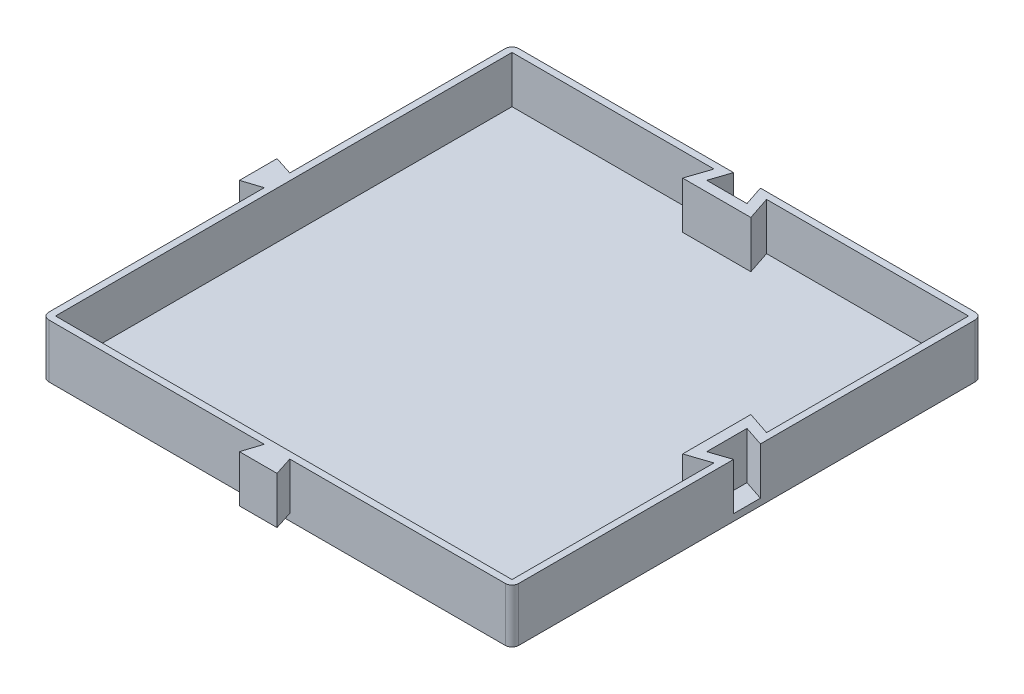
ISO-10303-21;
HEADER;
FILE_DESCRIPTION(('STEP AP214'),'2;1');
FILE_NAME('part.step','',(''),(''),'','','');
FILE_SCHEMA(('AUTOMOTIVE_DESIGN { 1 0 10303 214 1 1 1 1 }'));
ENDSEC;
DATA;
#1=APPLICATION_CONTEXT('core data for automotive mechanical design processes');
#2=APPLICATION_PROTOCOL_DEFINITION('international standard','automotive_design',2000,#1);
#3=PRODUCT_CONTEXT('',#1,'mechanical');
#4=PRODUCT('Part','Part','',(#3));
#5=PRODUCT_RELATED_PRODUCT_CATEGORY('part','',(#4));
#6=PRODUCT_DEFINITION_FORMATION('','',#4);
#7=PRODUCT_DEFINITION_CONTEXT('part definition',#1,'design');
#8=PRODUCT_DEFINITION('design','',#6,#7);
#9=PRODUCT_DEFINITION_SHAPE('','',#8);
#10=(LENGTH_UNIT() NAMED_UNIT(*) SI_UNIT(.MILLI.,.METRE.));
#11=(NAMED_UNIT(*) PLANE_ANGLE_UNIT() SI_UNIT($,.RADIAN.));
#12=(NAMED_UNIT(*) SI_UNIT($,.STERADIAN.) SOLID_ANGLE_UNIT());
#13=UNCERTAINTY_MEASURE_WITH_UNIT(LENGTH_MEASURE(1.E-05),#10,'distance_accuracy_value','');
#14=(GEOMETRIC_REPRESENTATION_CONTEXT(3) GLOBAL_UNCERTAINTY_ASSIGNED_CONTEXT((#13)) GLOBAL_UNIT_ASSIGNED_CONTEXT((#10,
#11,#12)) REPRESENTATION_CONTEXT('',''));
#15=CARTESIAN_POINT('',(0.,0.,0.));
#16=DIRECTION('',(0.,0.,1.));
#17=DIRECTION('',(1.,0.,0.));
#18=AXIS2_PLACEMENT_3D('',#15,#16,#17);
#19=CARTESIAN_POINT('',(0.,10.16,0.));
#20=DIRECTION('',(1.,0.,0.));
#21=DIRECTION('',(0.,0.,-1.));
#22=AXIS2_PLACEMENT_3D('',#19,#20,#21);
#23=PLANE('',#22);
#24=DIRECTION('',(0.,-1.,0.));
#25=VECTOR('',#24,1.);
#26=CARTESIAN_POINT('',(0.,10.16,-46.8630000000002));
#27=LINE('',#26,#25);
#28=CARTESIAN_POINT('',(0.,10.16,-46.8630000000002));
#29=VERTEX_POINT('',#28);
#30=CARTESIAN_POINT('',(0.,1.27,-46.8630000000002));
#31=VERTEX_POINT('',#30);
#32=EDGE_CURVE('E275',#29,#31,#27,.T.);
#33=ORIENTED_EDGE('',*,*,#32,.F.);
#34=DIRECTION('',(0.,0.,1.));
#35=VECTOR('',#34,1.);
#36=CARTESIAN_POINT('',(0.,10.16,0.));
#37=LINE('',#36,#35);
#38=CARTESIAN_POINT('',(0.,10.16,-87.63));
#39=VERTEX_POINT('',#38);
#40=EDGE_CURVE('E478',#39,#29,#37,.T.);
#41=ORIENTED_EDGE('',*,*,#40,.F.);
#42=DIRECTION('',(0.,-1.,0.));
#43=VECTOR('',#42,1.);
#44=CARTESIAN_POINT('',(0.,10.16,-87.63));
#45=LINE('',#44,#43);
#46=CARTESIAN_POINT('',(0.,0.,-87.63));
#47=VERTEX_POINT('',#46);
#48=EDGE_CURVE('E532',#39,#47,#45,.T.);
#49=ORIENTED_EDGE('',*,*,#48,.T.);
#50=DIRECTION('',(0.,0.,1.));
#51=VECTOR('',#50,1.);
#52=CARTESIAN_POINT('',(0.,0.,0.));
#53=LINE('',#52,#51);
#54=CARTESIAN_POINT('',(0.,0.,-1.27));
#55=VERTEX_POINT('',#54);
#56=EDGE_CURVE('E471',#47,#55,#53,.T.);
#57=ORIENTED_EDGE('',*,*,#56,.T.);
#58=DIRECTION('',(0.,-1.,0.));
#59=VECTOR('',#58,1.);
#60=CARTESIAN_POINT('',(0.,10.16,-1.27));
#61=LINE('',#60,#59);
#62=CARTESIAN_POINT('',(0.,10.16,-1.27));
#63=VERTEX_POINT('',#62);
#64=EDGE_CURVE('E535',#55,#63,#61,.F.);
#65=ORIENTED_EDGE('',*,*,#64,.T.);
#66=CARTESIAN_POINT('',(0.,10.16,-42.0370000000002));
#67=VERTEX_POINT('',#66);
#68=EDGE_CURVE('E62',#67,#63,#37,.T.);
#69=ORIENTED_EDGE('',*,*,#68,.F.);
#70=DIRECTION('',(0.,-1.,0.));
#71=VECTOR('',#70,1.);
#72=CARTESIAN_POINT('',(0.,10.16,-42.0370000000002));
#73=LINE('',#72,#71);
#74=CARTESIAN_POINT('',(0.,1.27,-42.0370000000002));
#75=VERTEX_POINT('',#74);
#76=EDGE_CURVE('E271',#67,#75,#73,.T.);
#77=ORIENTED_EDGE('',*,*,#76,.T.);
#78=DIRECTION('',(0.,0.,-1.));
#79=VECTOR('',#78,1.);
#80=CARTESIAN_POINT('',(0.,1.27,-46.8630000000002));
#81=LINE('',#80,#79);
#82=EDGE_CURVE('E56',#75,#31,#81,.T.);
#83=ORIENTED_EDGE('',*,*,#82,.T.);
#84=EDGE_LOOP('',(#33,#41,#49,#57,#65,#69,#77,#83));
#85=FACE_BOUND('',#84,.T.);
#86=ADVANCED_FACE('F41',(#85),#23,.F.);
#87=CARTESIAN_POINT('',(0.,10.16,0.));
#88=DIRECTION('',(0.,0.,-1.));
#89=DIRECTION('',(-1.,0.,0.));
#90=AXIS2_PLACEMENT_3D('',#87,#88,#89);
#91=PLANE('',#90);
#92=DIRECTION('',(0.,-1.,0.));
#93=VECTOR('',#92,1.);
#94=CARTESIAN_POINT('',(42.037,10.16,0.));
#95=LINE('',#94,#93);
#96=CARTESIAN_POINT('',(42.037,10.16,0.));
#97=VERTEX_POINT('',#96);
#98=CARTESIAN_POINT('',(42.037,1.27,0.));
#99=VERTEX_POINT('',#98);
#100=EDGE_CURVE('E312',#97,#99,#95,.T.);
#101=ORIENTED_EDGE('',*,*,#100,.F.);
#102=DIRECTION('',(1.,0.,0.));
#103=VECTOR('',#102,1.);
#104=CARTESIAN_POINT('',(0.,10.16,0.));
#105=LINE('',#104,#103);
#106=CARTESIAN_POINT('',(1.27,10.16,0.));
#107=VERTEX_POINT('',#106);
#108=EDGE_CURVE('E482',#107,#97,#105,.T.);
#109=ORIENTED_EDGE('',*,*,#108,.F.);
#110=DIRECTION('',(0.,-1.,0.));
#111=VECTOR('',#110,1.);
#112=CARTESIAN_POINT('',(1.27,10.16,0.));
#113=LINE('',#112,#111);
#114=CARTESIAN_POINT('',(1.27,0.,0.));
#115=VERTEX_POINT('',#114);
#116=EDGE_CURVE('E518',#107,#115,#113,.T.);
#117=ORIENTED_EDGE('',*,*,#116,.T.);
#118=DIRECTION('',(1.,0.,0.));
#119=VECTOR('',#118,1.);
#120=CARTESIAN_POINT('',(0.,0.,0.));
#121=LINE('',#120,#119);
#122=CARTESIAN_POINT('',(87.63,0.,0.));
#123=VERTEX_POINT('',#122);
#124=EDGE_CURVE('E496',#115,#123,#121,.T.);
#125=ORIENTED_EDGE('',*,*,#124,.T.);
#126=DIRECTION('',(0.,-1.,0.));
#127=VECTOR('',#126,1.);
#128=CARTESIAN_POINT('',(87.63,10.16,0.));
#129=LINE('',#128,#127);
#130=CARTESIAN_POINT('',(87.63,10.16,0.));
#131=VERTEX_POINT('',#130);
#132=EDGE_CURVE('E521',#123,#131,#129,.F.);
#133=ORIENTED_EDGE('',*,*,#132,.T.);
#134=CARTESIAN_POINT('',(46.863,10.16,0.));
#135=VERTEX_POINT('',#134);
#136=EDGE_CURVE('E481',#135,#131,#105,.T.);
#137=ORIENTED_EDGE('',*,*,#136,.F.);
#138=DIRECTION('',(0.,-1.,0.));
#139=VECTOR('',#138,1.);
#140=CARTESIAN_POINT('',(46.863,10.16,0.));
#141=LINE('',#140,#139);
#142=CARTESIAN_POINT('',(46.863,1.27,0.));
#143=VERTEX_POINT('',#142);
#144=EDGE_CURVE('E323',#135,#143,#141,.T.);
#145=ORIENTED_EDGE('',*,*,#144,.T.);
#146=DIRECTION('',(-1.,0.,0.));
#147=VECTOR('',#146,1.);
#148=CARTESIAN_POINT('',(42.037,1.27,0.));
#149=LINE('',#148,#147);
#150=EDGE_CURVE('E307',#143,#99,#149,.T.);
#151=ORIENTED_EDGE('',*,*,#150,.T.);
#152=EDGE_LOOP('',(#101,#109,#117,#125,#133,#137,#145,#151));
#153=FACE_BOUND('',#152,.T.);
#154=ADVANCED_FACE('F576',(#153),#91,.F.);
#155=CARTESIAN_POINT('',(88.9,10.16,0.));
#156=DIRECTION('',(-1.,0.,0.));
#157=DIRECTION('',(0.,0.,1.));
#158=AXIS2_PLACEMENT_3D('',#155,#156,#157);
#159=PLANE('',#158);
#160=DIRECTION('',(0.,-1.,0.));
#161=VECTOR('',#160,1.);
#162=CARTESIAN_POINT('',(88.9000000000015,10.16,-41.9100000000017));
#163=LINE('',#162,#161);
#164=CARTESIAN_POINT('',(88.9000000000015,10.16,-41.9100000000017));
#165=VERTEX_POINT('',#164);
#166=CARTESIAN_POINT('',(88.9000000000015,1.27,-41.9100000000017));
#167=VERTEX_POINT('',#166);
#168=EDGE_CURVE('E356',#165,#167,#163,.T.);
#169=ORIENTED_EDGE('',*,*,#168,.F.);
#170=DIRECTION('',(0.,0.,-1.));
#171=VECTOR('',#170,1.);
#172=CARTESIAN_POINT('',(88.9,10.16,0.));
#173=LINE('',#172,#171);
#174=CARTESIAN_POINT('',(88.9,10.16,-1.27));
#175=VERTEX_POINT('',#174);
#176=EDGE_CURVE('E486',#175,#165,#173,.T.);
#177=ORIENTED_EDGE('',*,*,#176,.F.);
#178=DIRECTION('',(0.,-1.,0.));
#179=VECTOR('',#178,1.);
#180=CARTESIAN_POINT('',(88.9,10.16,-1.27));
#181=LINE('',#180,#179);
#182=CARTESIAN_POINT('',(88.9,0.,-1.27));
#183=VERTEX_POINT('',#182);
#184=EDGE_CURVE('E507',#175,#183,#181,.T.);
#185=ORIENTED_EDGE('',*,*,#184,.T.);
#186=DIRECTION('',(0.,0.,-1.));
#187=VECTOR('',#186,1.);
#188=CARTESIAN_POINT('',(88.9,0.,0.));
#189=LINE('',#188,#187);
#190=CARTESIAN_POINT('',(88.9,0.,-87.63));
#191=VERTEX_POINT('',#190);
#192=EDGE_CURVE('E499',#183,#191,#189,.T.);
#193=ORIENTED_EDGE('',*,*,#192,.T.);
#194=DIRECTION('',(0.,-1.,0.));
#195=VECTOR('',#194,1.);
#196=CARTESIAN_POINT('',(88.9,10.16,-87.63));
#197=LINE('',#196,#195);
#198=CARTESIAN_POINT('',(88.9,10.16,-87.63));
#199=VERTEX_POINT('',#198);
#200=EDGE_CURVE('E493',#191,#199,#197,.F.);
#201=ORIENTED_EDGE('',*,*,#200,.T.);
#202=CARTESIAN_POINT('',(88.9000000000016,10.16,-46.9900000000017));
#203=VERTEX_POINT('',#202);
#204=EDGE_CURVE('E485',#203,#199,#173,.T.);
#205=ORIENTED_EDGE('',*,*,#204,.F.);
#206=DIRECTION('',(0.,-1.,0.));
#207=VECTOR('',#206,1.);
#208=CARTESIAN_POINT('',(88.9000000000016,10.16,-46.9900000000017));
#209=LINE('',#208,#207);
#210=CARTESIAN_POINT('',(88.9000000000016,1.27,-46.9900000000017));
#211=VERTEX_POINT('',#210);
#212=EDGE_CURVE('E353',#203,#211,#209,.T.);
#213=ORIENTED_EDGE('',*,*,#212,.T.);
#214=DIRECTION('',(0.,0.,-1.));
#215=VECTOR('',#214,1.);
#216=CARTESIAN_POINT('',(88.9000000000015,1.27,-41.9100000000017));
#217=LINE('',#216,#215);
#218=EDGE_CURVE('E343',#167,#211,#217,.T.);
#219=ORIENTED_EDGE('',*,*,#218,.F.);
#220=EDGE_LOOP('',(#169,#177,#185,#193,#201,#205,#213,#219));
#221=FACE_BOUND('',#220,.T.);
#222=ADVANCED_FACE('F585',(#221),#159,.F.);
#223=CARTESIAN_POINT('',(0.,10.16,0.));
#224=DIRECTION('',(0.,-1.,0.));
#225=DIRECTION('',(0.,0.,-1.));
#226=AXIS2_PLACEMENT_3D('',#223,#224,#225);
#227=PLANE('',#226);
#228=DIRECTION('',(-1.,0.,0.));
#229=VECTOR('',#228,1.);
#230=CARTESIAN_POINT('',(87.63,10.16,-87.63));
#231=LINE('',#230,#229);
#232=CARTESIAN_POINT('',(39.4786203524597,10.16,-87.63));
#233=VERTEX_POINT('',#232);
#234=CARTESIAN_POINT('',(1.27,10.16,-87.63));
#235=VERTEX_POINT('',#234);
#236=EDGE_CURVE('E441',#233,#235,#231,.T.);
#237=ORIENTED_EDGE('',*,*,#236,.F.);
#238=DIRECTION('',(-0.316227766016839,0.,0.948683298050513));
#239=VECTOR('',#238,1.);
#240=CARTESIAN_POINT('',(9.24175831721364,10.16,3.08058610573789));
#241=LINE('',#240,#239);
#242=CARTESIAN_POINT('',(37.9969536857931,10.16,-83.185));
#243=VERTEX_POINT('',#242);
#244=EDGE_CURVE('E395',#233,#243,#241,.T.);
#245=ORIENTED_EDGE('',*,*,#244,.T.);
#246=DIRECTION('',(1.,0.,0.));
#247=VECTOR('',#246,1.);
#248=CARTESIAN_POINT('',(0.,10.16,-83.185));
#249=LINE('',#248,#247);
#250=CARTESIAN_POINT('',(50.9030463142069,10.16,-83.185));
#251=VERTEX_POINT('',#250);
#252=EDGE_CURVE('E397',#243,#251,#249,.T.);
#253=ORIENTED_EDGE('',*,*,#252,.T.);
#254=DIRECTION('',(0.316227766016839,0.,0.948683298050513));
#255=VECTOR('',#254,1.);
#256=CARTESIAN_POINT('',(70.7682416827863,10.16,-23.5894138942622));
#257=LINE('',#256,#255);
#258=CARTESIAN_POINT('',(49.4213796475402,10.16,-87.63));
#259=VERTEX_POINT('',#258);
#260=EDGE_CURVE('E400',#259,#251,#257,.T.);
#261=ORIENTED_EDGE('',*,*,#260,.F.);
#262=CARTESIAN_POINT('',(87.63,10.16,-87.63));
#263=VERTEX_POINT('',#262);
#264=EDGE_CURVE('E457',#263,#259,#231,.T.);
#265=ORIENTED_EDGE('',*,*,#264,.F.);
#266=DIRECTION('',(0.,0.,-1.));
#267=VECTOR('',#266,1.);
#268=CARTESIAN_POINT('',(87.63,10.16,-1.27));
#269=LINE('',#268,#267);
#270=CARTESIAN_POINT('',(87.6300000000023,10.16,-49.4213796475433));
#271=VERTEX_POINT('',#270);
#272=EDGE_CURVE('E465',#271,#263,#269,.T.);
#273=ORIENTED_EDGE('',*,*,#272,.F.);
#274=DIRECTION('',(-0.948683298050513,0.,-0.316227766016842));
#275=VECTOR('',#274,1.);
#276=CARTESIAN_POINT('',(23.5894138942636,10.16,-70.7682416827898));
#277=LINE('',#276,#275);
#278=CARTESIAN_POINT('',(83.1850000000023,10.16,-50.90304631421));
#279=VERTEX_POINT('',#278);
#280=EDGE_CURVE('E359',#271,#279,#277,.T.);
#281=ORIENTED_EDGE('',*,*,#280,.T.);
#282=DIRECTION('',(0.,0.,1.));
#283=VECTOR('',#282,1.);
#284=CARTESIAN_POINT('',(83.1850000000021,10.16,3.57791877690856E-13));
#285=LINE('',#284,#283);
#286=CARTESIAN_POINT('',(83.1850000000023,10.16,-37.9969536857962));
#287=VERTEX_POINT('',#286);
#288=EDGE_CURVE('E361',#279,#287,#285,.T.);
#289=ORIENTED_EDGE('',*,*,#288,.T.);
#290=DIRECTION('',(0.948683298050515,0.,-0.316227766016833));
#291=VECTOR('',#290,1.);
#292=CARTESIAN_POINT('',(-3.08058610573871,10.16,-9.24175831721628));
#293=LINE('',#292,#291);
#294=CARTESIAN_POINT('',(87.63,10.16,-39.4786203524628));
#295=VERTEX_POINT('',#294);
#296=EDGE_CURVE('E364',#287,#295,#293,.T.);
#297=ORIENTED_EDGE('',*,*,#296,.T.);
#298=CARTESIAN_POINT('',(87.63,10.16,-1.27));
#299=VERTEX_POINT('',#298);
#300=EDGE_CURVE('E466',#299,#295,#269,.T.);
#301=ORIENTED_EDGE('',*,*,#300,.F.);
#302=DIRECTION('',(1.,0.,0.));
#303=VECTOR('',#302,1.);
#304=CARTESIAN_POINT('',(1.27,10.16,-1.27));
#305=LINE('',#304,#303);
#306=CARTESIAN_POINT('',(1.27,10.16,-1.27));
#307=VERTEX_POINT('',#306);
#308=EDGE_CURVE('E462',#307,#299,#305,.T.);
#309=ORIENTED_EDGE('',*,*,#308,.F.);
#310=DIRECTION('',(0.,0.,1.));
#311=VECTOR('',#310,1.);
#312=CARTESIAN_POINT('',(1.27,10.16,-87.63));
#313=LINE('',#312,#311);
#314=EDGE_CURVE('E459',#235,#307,#313,.T.);
#315=ORIENTED_EDGE('',*,*,#314,.F.);
#316=EDGE_LOOP('',(#237,#245,#253,#261,#265,#273,#281,#289,#297,#301,#309,#315));
#317=FACE_BOUND('',#316,.T.);
#318=DIRECTION('',(0.948683298050512,0.,-0.316227766016843));
#319=VECTOR('',#318,1.);
#320=CARTESIAN_POINT('',(85.0900000000016,10.16,-40.6400000000017));
#321=LINE('',#320,#319);
#322=CARTESIAN_POINT('',(85.0900000000016,10.16,-40.6400000000017));
#323=VERTEX_POINT('',#322);
#324=EDGE_CURVE('E332',#323,#165,#321,.T.);
#325=ORIENTED_EDGE('',*,*,#324,.F.);
#326=DIRECTION('',(0.,0.,1.));
#327=VECTOR('',#326,1.);
#328=CARTESIAN_POINT('',(85.0900000000016,10.16,-48.2600000000017));
#329=LINE('',#328,#327);
#330=CARTESIAN_POINT('',(85.0900000000016,10.16,-48.2600000000017));
#331=VERTEX_POINT('',#330);
#332=EDGE_CURVE('E338',#331,#323,#329,.T.);
#333=ORIENTED_EDGE('',*,*,#332,.F.);
#334=DIRECTION('',(-0.948683298050513,0.,-0.316227766016841));
#335=VECTOR('',#334,1.);
#336=CARTESIAN_POINT('',(88.9000000000016,10.16,-46.9900000000017));
#337=LINE('',#336,#335);
#338=EDGE_CURVE('E334',#203,#331,#337,.T.);
#339=ORIENTED_EDGE('',*,*,#338,.F.);
#340=ORIENTED_EDGE('',*,*,#204,.T.);
#341=CARTESIAN_POINT('',(87.63,10.16,-87.63));
#342=DIRECTION('',(0.,-1.,0.));
#343=DIRECTION('',(0.,0.,-1.));
#344=AXIS2_PLACEMENT_3D('',#341,#342,#343);
#345=CIRCLE('',#344,1.27);
#346=CARTESIAN_POINT('',(87.63,10.16,-88.9));
#347=VERTEX_POINT('',#346);
#348=EDGE_CURVE('E524',#199,#347,#345,.F.);
#349=ORIENTED_EDGE('',*,*,#348,.T.);
#350=DIRECTION('',(-1.,0.,0.));
#351=VECTOR('',#350,1.);
#352=CARTESIAN_POINT('',(0.,10.16,-88.9));
#353=LINE('',#352,#351);
#354=CARTESIAN_POINT('',(46.99,10.16,-88.9));
#355=VERTEX_POINT('',#354);
#356=EDGE_CURVE('E490',#347,#355,#353,.T.);
#357=ORIENTED_EDGE('',*,*,#356,.T.);
#358=DIRECTION('',(0.31622776601684,0.,0.948683298050513));
#359=VECTOR('',#358,1.);
#360=CARTESIAN_POINT('',(68.9610000000001,10.16,-22.9870000000001));
#361=LINE('',#360,#359);
#362=CARTESIAN_POINT('',(48.26,10.16,-85.09));
#363=VERTEX_POINT('',#362);
#364=EDGE_CURVE('E403',#355,#363,#361,.T.);
#365=ORIENTED_EDGE('',*,*,#364,.T.);
#366=DIRECTION('',(1.,0.,0.));
#367=VECTOR('',#366,1.);
#368=CARTESIAN_POINT('',(0.,10.16,-85.09));
#369=LINE('',#368,#367);
#370=CARTESIAN_POINT('',(40.64,10.16,-85.09));
#371=VERTEX_POINT('',#370);
#372=EDGE_CURVE('E405',#371,#363,#369,.T.);
#373=ORIENTED_EDGE('',*,*,#372,.F.);
#374=DIRECTION('',(-0.31622776601684,0.,0.948683298050513));
#375=VECTOR('',#374,1.);
#376=CARTESIAN_POINT('',(11.0489999999998,10.16,3.68299999999997));
#377=LINE('',#376,#375);
#378=CARTESIAN_POINT('',(41.91,10.16,-88.9));
#379=VERTEX_POINT('',#378);
#380=EDGE_CURVE('E408',#379,#371,#377,.T.);
#381=ORIENTED_EDGE('',*,*,#380,.F.);
#382=CARTESIAN_POINT('',(1.27,10.16,-88.9));
#383=VERTEX_POINT('',#382);
#384=EDGE_CURVE('E489',#379,#383,#353,.T.);
#385=ORIENTED_EDGE('',*,*,#384,.T.);
#386=CARTESIAN_POINT('',(1.27,10.16,-87.63));
#387=DIRECTION('',(0.,-1.,0.));
#388=DIRECTION('',(0.,0.,-1.));
#389=AXIS2_PLACEMENT_3D('',#386,#387,#388);
#390=CIRCLE('',#389,1.27);
#391=EDGE_CURVE('E526',#383,#39,#390,.F.);
#392=ORIENTED_EDGE('',*,*,#391,.T.);
#393=ORIENTED_EDGE('',*,*,#40,.T.);
#394=DIRECTION('',(-0.952028561285262,0.,-0.306009180413127));
#395=VECTOR('',#394,1.);
#396=CARTESIAN_POINT('',(0.,10.16,-46.8630000000002));
#397=LINE('',#396,#395);
#398=CARTESIAN_POINT('',(-3.556,10.16,-48.0060000000002));
#399=VERTEX_POINT('',#398);
#400=EDGE_CURVE('E290',#29,#399,#397,.T.);
#401=ORIENTED_EDGE('',*,*,#400,.T.);
#402=DIRECTION('',(0.,0.,1.));
#403=VECTOR('',#402,1.);
#404=CARTESIAN_POINT('',(-3.556,10.16,-48.0060000000002));
#405=LINE('',#404,#403);
#406=CARTESIAN_POINT('',(-3.55600000000003,10.16,-40.8940000000002));
#407=VERTEX_POINT('',#406);
#408=EDGE_CURVE('E293',#399,#407,#405,.T.);
#409=ORIENTED_EDGE('',*,*,#408,.T.);
#410=DIRECTION('',(0.952028561285266,0.,-0.306009180413117));
#411=VECTOR('',#410,1.);
#412=CARTESIAN_POINT('',(0.,10.16,-42.0370000000002));
#413=LINE('',#412,#411);
#414=EDGE_CURVE('E300',#407,#67,#413,.T.);
#415=ORIENTED_EDGE('',*,*,#414,.T.);
#416=ORIENTED_EDGE('',*,*,#68,.T.);
#417=CARTESIAN_POINT('',(1.27,10.16,-1.27));
#418=DIRECTION('',(0.,-1.,0.));
#419=DIRECTION('',(0.,0.,-1.));
#420=AXIS2_PLACEMENT_3D('',#417,#418,#419);
#421=CIRCLE('',#420,1.27);
#422=EDGE_CURVE('E528',#63,#107,#421,.F.);
#423=ORIENTED_EDGE('',*,*,#422,.T.);
#424=ORIENTED_EDGE('',*,*,#108,.T.);
#425=DIRECTION('',(-0.306009180413124,0.,0.952028561285263));
#426=VECTOR('',#425,1.);
#427=CARTESIAN_POINT('',(42.037,10.16,0.));
#428=LINE('',#427,#426);
#429=CARTESIAN_POINT('',(40.894,10.16,3.556));
#430=VERTEX_POINT('',#429);
#431=EDGE_CURVE('E303',#97,#430,#428,.T.);
#432=ORIENTED_EDGE('',*,*,#431,.T.);
#433=DIRECTION('',(1.,0.,0.));
#434=VECTOR('',#433,1.);
#435=CARTESIAN_POINT('',(40.894,10.16,3.556));
#436=LINE('',#435,#434);
#437=CARTESIAN_POINT('',(48.006,10.16,3.556));
#438=VERTEX_POINT('',#437);
#439=EDGE_CURVE('E306',#430,#438,#436,.T.);
#440=ORIENTED_EDGE('',*,*,#439,.T.);
#441=DIRECTION('',(-0.30600918041312,0.,-0.952028561285264));
#442=VECTOR('',#441,1.);
#443=CARTESIAN_POINT('',(46.863,10.16,0.));
#444=LINE('',#443,#442);
#445=EDGE_CURVE('E309',#438,#135,#444,.T.);
#446=ORIENTED_EDGE('',*,*,#445,.T.);
#447=ORIENTED_EDGE('',*,*,#136,.T.);
#448=CARTESIAN_POINT('',(87.63,10.16,-1.27));
#449=DIRECTION('',(0.,-1.,0.));
#450=DIRECTION('',(0.,0.,-1.));
#451=AXIS2_PLACEMENT_3D('',#448,#449,#450);
#452=CIRCLE('',#451,1.27);
#453=EDGE_CURVE('E530',#131,#175,#452,.F.);
#454=ORIENTED_EDGE('',*,*,#453,.T.);
#455=ORIENTED_EDGE('',*,*,#176,.T.);
#456=EDGE_LOOP('',(#325,#333,#339,#340,#349,#357,#365,#373,#381,#385,#392,#393,#401,#409,#415,
#416,#423,#424,#432,#440,#446,#447,#454,#455));
#457=FACE_BOUND('',#456,.T.);
#458=ADVANCED_FACE('F559',(#317,#457),#227,.F.);
#459=CARTESIAN_POINT('',(87.63,1.27,-1.27));
#460=DIRECTION('',(1.,0.,0.));
#461=DIRECTION('',(0.,0.,-1.));
#462=AXIS2_PLACEMENT_3D('',#459,#460,#461);
#463=PLANE('',#462);
#464=DIRECTION('',(0.,-1.,0.));
#465=VECTOR('',#464,1.);
#466=CARTESIAN_POINT('',(87.6300000000023,10.16,-49.4213796475433));
#467=LINE('',#466,#465);
#468=CARTESIAN_POINT('',(87.63,1.27,-49.4213796475433));
#469=VERTEX_POINT('',#468);
#470=EDGE_CURVE('E382',#271,#469,#467,.T.);
#471=ORIENTED_EDGE('',*,*,#470,.F.);
#472=ORIENTED_EDGE('',*,*,#272,.T.);
#473=DIRECTION('',(0.,1.,0.));
#474=VECTOR('',#473,1.);
#475=CARTESIAN_POINT('',(87.63,1.27,-87.63));
#476=LINE('',#475,#474);
#477=CARTESIAN_POINT('',(87.63,1.27,-87.63));
#478=VERTEX_POINT('',#477);
#479=EDGE_CURVE('E468',#478,#263,#476,.T.);
#480=ORIENTED_EDGE('',*,*,#479,.F.);
#481=DIRECTION('',(0.,0.,-1.));
#482=VECTOR('',#481,1.);
#483=CARTESIAN_POINT('',(87.63,1.27,-1.27));
#484=LINE('',#483,#482);
#485=EDGE_CURVE('E452',#469,#478,#484,.T.);
#486=ORIENTED_EDGE('',*,*,#485,.F.);
#487=EDGE_LOOP('',(#471,#472,#480,#486));
#488=FACE_BOUND('',#487,.T.);
#489=ADVANCED_FACE('F697',(#488),#463,.F.);
#490=DIRECTION('',(0.,-1.,0.));
#491=VECTOR('',#490,1.);
#492=CARTESIAN_POINT('',(87.6300000000023,10.16,-39.4786203524628));
#493=LINE('',#492,#491);
#494=CARTESIAN_POINT('',(87.63,1.27,-39.4786203524628));
#495=VERTEX_POINT('',#494);
#496=EDGE_CURVE('E367',#295,#495,#493,.T.);
#497=ORIENTED_EDGE('',*,*,#496,.T.);
#498=CARTESIAN_POINT('',(87.63,1.27,-1.27));
#499=VERTEX_POINT('',#498);
#500=EDGE_CURVE('E453',#499,#495,#484,.T.);
#501=ORIENTED_EDGE('',*,*,#500,.F.);
#502=DIRECTION('',(0.,1.,0.));
#503=VECTOR('',#502,1.);
#504=CARTESIAN_POINT('',(87.63,1.27,-1.27));
#505=LINE('',#504,#503);
#506=EDGE_CURVE('E472',#499,#299,#505,.T.);
#507=ORIENTED_EDGE('',*,*,#506,.T.);
#508=ORIENTED_EDGE('',*,*,#300,.T.);
#509=EDGE_LOOP('',(#497,#501,#507,#508));
#510=FACE_BOUND('',#509,.T.);
#511=ADVANCED_FACE('F700',(#510),#463,.F.);
#512=CARTESIAN_POINT('',(0.,1.27,0.));
#513=DIRECTION('',(0.,1.,0.));
#514=DIRECTION('',(0.,0.,1.));
#515=AXIS2_PLACEMENT_3D('',#512,#513,#514);
#516=PLANE('',#515);
#517=DIRECTION('',(1.,0.,0.));
#518=VECTOR('',#517,1.);
#519=CARTESIAN_POINT('',(0.,1.27,-85.09));
#520=LINE('',#519,#518);
#521=CARTESIAN_POINT('',(40.64,1.27,-85.09));
#522=VERTEX_POINT('',#521);
#523=CARTESIAN_POINT('',(48.26,1.27,-85.09));
#524=VERTEX_POINT('',#523);
#525=EDGE_CURVE('E422',#522,#524,#520,.T.);
#526=ORIENTED_EDGE('',*,*,#525,.T.);
#527=DIRECTION('',(0.31622776601684,0.,0.948683298050513));
#528=VECTOR('',#527,1.);
#529=CARTESIAN_POINT('',(68.9610000000001,1.27,-22.9870000000001));
#530=LINE('',#529,#528);
#531=CARTESIAN_POINT('',(46.99,1.27,-88.9));
#532=VERTEX_POINT('',#531);
#533=EDGE_CURVE('E419',#532,#524,#530,.T.);
#534=ORIENTED_EDGE('',*,*,#533,.F.);
#535=DIRECTION('',(-1.,0.,0.));
#536=VECTOR('',#535,1.);
#537=CARTESIAN_POINT('',(46.99,1.27,-88.9));
#538=LINE('',#537,#536);
#539=CARTESIAN_POINT('',(41.91,1.27,-88.9));
#540=VERTEX_POINT('',#539);
#541=EDGE_CURVE('E385',#532,#540,#538,.T.);
#542=ORIENTED_EDGE('',*,*,#541,.T.);
#543=DIRECTION('',(-0.31622776601684,0.,0.948683298050513));
#544=VECTOR('',#543,1.);
#545=CARTESIAN_POINT('',(11.0489999999998,1.27,3.68299999999997));
#546=LINE('',#545,#544);
#547=EDGE_CURVE('E398',#540,#522,#546,.T.);
#548=ORIENTED_EDGE('',*,*,#547,.T.);
#549=EDGE_LOOP('',(#526,#534,#542,#548));
#550=FACE_BOUND('',#549,.T.);
#551=ADVANCED_FACE('F696',(#550),#516,.T.);
#552=CARTESIAN_POINT('',(87.63,1.27,-87.63));
#553=DIRECTION('',(0.,0.,-1.));
#554=DIRECTION('',(-1.,0.,0.));
#555=AXIS2_PLACEMENT_3D('',#552,#553,#554);
#556=PLANE('',#555);
#557=DIRECTION('',(0.,-1.,0.));
#558=VECTOR('',#557,1.);
#559=CARTESIAN_POINT('',(39.4786203524597,10.16,-87.63));
#560=LINE('',#559,#558);
#561=CARTESIAN_POINT('',(39.4786203524597,1.27,-87.63));
#562=VERTEX_POINT('',#561);
#563=EDGE_CURVE('E438',#233,#562,#560,.T.);
#564=ORIENTED_EDGE('',*,*,#563,.F.);
#565=ORIENTED_EDGE('',*,*,#236,.T.);
#566=DIRECTION('',(0.,1.,0.));
#567=VECTOR('',#566,1.);
#568=CARTESIAN_POINT('',(1.27,1.27,-87.63));
#569=LINE('',#568,#567);
#570=CARTESIAN_POINT('',(1.27,1.27,-87.63));
#571=VERTEX_POINT('',#570);
#572=EDGE_CURVE('E456',#571,#235,#569,.T.);
#573=ORIENTED_EDGE('',*,*,#572,.F.);
#574=DIRECTION('',(-1.,0.,0.));
#575=VECTOR('',#574,1.);
#576=CARTESIAN_POINT('',(87.63,1.27,-87.63));
#577=LINE('',#576,#575);
#578=EDGE_CURVE('E446',#562,#571,#577,.T.);
#579=ORIENTED_EDGE('',*,*,#578,.F.);
#580=EDGE_LOOP('',(#564,#565,#573,#579));
#581=FACE_BOUND('',#580,.T.);
#582=ADVANCED_FACE('F713',(#581),#556,.F.);
#583=CARTESIAN_POINT('',(0.,10.16,-88.9));
#584=DIRECTION('',(0.,0.,1.));
#585=DIRECTION('',(1.,0.,0.));
#586=AXIS2_PLACEMENT_3D('',#583,#584,#585);
#587=PLANE('',#586);
#588=ORIENTED_EDGE('',*,*,#384,.F.);
#589=DIRECTION('',(0.,1.,0.));
#590=VECTOR('',#589,1.);
#591=CARTESIAN_POINT('',(41.91,1.27,-88.9));
#592=LINE('',#591,#590);
#593=EDGE_CURVE('E389',#540,#379,#592,.T.);
#594=ORIENTED_EDGE('',*,*,#593,.F.);
#595=ORIENTED_EDGE('',*,*,#541,.F.);
#596=DIRECTION('',(0.,1.,0.));
#597=VECTOR('',#596,1.);
#598=CARTESIAN_POINT('',(46.99,1.27,-88.9));
#599=LINE('',#598,#597);
#600=EDGE_CURVE('E388',#532,#355,#599,.T.);
#601=ORIENTED_EDGE('',*,*,#600,.T.);
#602=ORIENTED_EDGE('',*,*,#356,.F.);
#603=DIRECTION('',(0.,-1.,0.));
#604=VECTOR('',#603,1.);
#605=CARTESIAN_POINT('',(87.63,10.16,-88.9));
#606=LINE('',#605,#604);
#607=CARTESIAN_POINT('',(87.63,0.,-88.9));
#608=VERTEX_POINT('',#607);
#609=EDGE_CURVE('E49',#347,#608,#606,.T.);
#610=ORIENTED_EDGE('',*,*,#609,.T.);
#611=DIRECTION('',(-1.,0.,0.));
#612=VECTOR('',#611,1.);
#613=CARTESIAN_POINT('',(0.,0.,-88.9));
#614=LINE('',#613,#612);
#615=CARTESIAN_POINT('',(1.27,0.,-88.9));
#616=VERTEX_POINT('',#615);
#617=EDGE_CURVE('E502',#608,#616,#614,.T.);
#618=ORIENTED_EDGE('',*,*,#617,.T.);
#619=DIRECTION('',(0.,-1.,0.));
#620=VECTOR('',#619,1.);
#621=CARTESIAN_POINT('',(1.27,10.16,-88.9));
#622=LINE('',#621,#620);
#623=EDGE_CURVE('E11',#616,#383,#622,.F.);
#624=ORIENTED_EDGE('',*,*,#623,.T.);
#625=EDGE_LOOP('',(#588,#594,#595,#601,#602,#610,#618,#624));
#626=FACE_BOUND('',#625,.T.);
#627=ADVANCED_FACE('F542',(#626),#587,.F.);
#628=CARTESIAN_POINT('',(0.,0.,0.));
#629=DIRECTION('',(0.,-1.,0.));
#630=DIRECTION('',(0.,0.,-1.));
#631=AXIS2_PLACEMENT_3D('',#628,#629,#630);
#632=PLANE('',#631);
#633=ORIENTED_EDGE('',*,*,#192,.F.);
#634=CARTESIAN_POINT('',(87.63,0.,-1.27));
#635=DIRECTION('',(0.,-1.,0.));
#636=DIRECTION('',(0.,0.,-1.));
#637=AXIS2_PLACEMENT_3D('',#634,#635,#636);
#638=CIRCLE('',#637,1.27);
#639=EDGE_CURVE('E516',#183,#123,#638,.T.);
#640=ORIENTED_EDGE('',*,*,#639,.T.);
#641=ORIENTED_EDGE('',*,*,#124,.F.);
#642=CARTESIAN_POINT('',(1.27,0.,-1.27));
#643=DIRECTION('',(0.,-1.,0.));
#644=DIRECTION('',(0.,0.,-1.));
#645=AXIS2_PLACEMENT_3D('',#642,#643,#644);
#646=CIRCLE('',#645,1.27);
#647=EDGE_CURVE('E514',#115,#55,#646,.T.);
#648=ORIENTED_EDGE('',*,*,#647,.T.);
#649=ORIENTED_EDGE('',*,*,#56,.F.);
#650=CARTESIAN_POINT('',(1.27,0.,-87.63));
#651=DIRECTION('',(0.,-1.,0.));
#652=DIRECTION('',(0.,0.,-1.));
#653=AXIS2_PLACEMENT_3D('',#650,#651,#652);
#654=CIRCLE('',#653,1.27);
#655=EDGE_CURVE('E512',#47,#616,#654,.T.);
#656=ORIENTED_EDGE('',*,*,#655,.T.);
#657=ORIENTED_EDGE('',*,*,#617,.F.);
#658=CARTESIAN_POINT('',(87.63,0.,-87.63));
#659=DIRECTION('',(0.,-1.,0.));
#660=DIRECTION('',(0.,0.,-1.));
#661=AXIS2_PLACEMENT_3D('',#658,#659,#660);
#662=CIRCLE('',#661,1.27);
#663=EDGE_CURVE('E510',#608,#191,#662,.T.);
#664=ORIENTED_EDGE('',*,*,#663,.T.);
#665=EDGE_LOOP('',(#633,#640,#641,#648,#649,#656,#657,#664));
#666=FACE_BOUND('',#665,.T.);
#667=ADVANCED_FACE('F548',(#666),#632,.T.);
#668=ORIENTED_EDGE('',*,*,#264,.T.);
#669=DIRECTION('',(0.,-1.,0.));
#670=VECTOR('',#669,1.);
#671=CARTESIAN_POINT('',(49.4213796475402,10.16,-87.63));
#672=LINE('',#671,#670);
#673=CARTESIAN_POINT('',(49.4213796475402,1.27,-87.63));
#674=VERTEX_POINT('',#673);
#675=EDGE_CURVE('E430',#259,#674,#672,.T.);
#676=ORIENTED_EDGE('',*,*,#675,.T.);
#677=EDGE_CURVE('E442',#478,#674,#577,.T.);
#678=ORIENTED_EDGE('',*,*,#677,.F.);
#679=ORIENTED_EDGE('',*,*,#479,.T.);
#680=EDGE_LOOP('',(#668,#676,#678,#679));
#681=FACE_BOUND('',#680,.T.);
#682=ADVANCED_FACE('F705',(#681),#556,.F.);
#683=CARTESIAN_POINT('',(1.27,1.27,-1.27));
#684=DIRECTION('',(0.,0.,1.));
#685=DIRECTION('',(1.,0.,0.));
#686=AXIS2_PLACEMENT_3D('',#683,#684,#685);
#687=PLANE('',#686);
#688=ORIENTED_EDGE('',*,*,#308,.T.);
#689=ORIENTED_EDGE('',*,*,#506,.F.);
#690=DIRECTION('',(1.,0.,0.));
#691=VECTOR('',#690,1.);
#692=CARTESIAN_POINT('',(1.27,1.27,-1.27));
#693=LINE('',#692,#691);
#694=CARTESIAN_POINT('',(1.27,1.27,-1.27));
#695=VERTEX_POINT('',#694);
#696=EDGE_CURVE('E449',#695,#499,#693,.T.);
#697=ORIENTED_EDGE('',*,*,#696,.F.);
#698=DIRECTION('',(0.,1.,0.));
#699=VECTOR('',#698,1.);
#700=CARTESIAN_POINT('',(1.27,1.27,-1.27));
#701=LINE('',#700,#699);
#702=EDGE_CURVE('E474',#695,#307,#701,.T.);
#703=ORIENTED_EDGE('',*,*,#702,.T.);
#704=EDGE_LOOP('',(#688,#689,#697,#703));
#705=FACE_BOUND('',#704,.T.);
#706=ADVANCED_FACE('F702',(#705),#687,.F.);
#707=CARTESIAN_POINT('',(1.27,1.27,-87.63));
#708=DIRECTION('',(-1.,0.,0.));
#709=DIRECTION('',(0.,0.,1.));
#710=AXIS2_PLACEMENT_3D('',#707,#708,#709);
#711=PLANE('',#710);
#712=ORIENTED_EDGE('',*,*,#314,.T.);
#713=ORIENTED_EDGE('',*,*,#702,.F.);
#714=DIRECTION('',(0.,0.,1.));
#715=VECTOR('',#714,1.);
#716=CARTESIAN_POINT('',(1.27,1.27,-87.63));
#717=LINE('',#716,#715);
#718=EDGE_CURVE('E445',#571,#695,#717,.T.);
#719=ORIENTED_EDGE('',*,*,#718,.F.);
#720=ORIENTED_EDGE('',*,*,#572,.T.);
#721=EDGE_LOOP('',(#712,#713,#719,#720));
#722=FACE_BOUND('',#721,.T.);
#723=ADVANCED_FACE('F624',(#722),#711,.F.);
#724=CARTESIAN_POINT('',(87.63,10.16,-1.27));
#725=DIRECTION('',(0.,-1.,0.));
#726=DIRECTION('',(0.,0.,-1.));
#727=AXIS2_PLACEMENT_3D('',#724,#725,#726);
#728=CYLINDRICAL_SURFACE('',#727,1.27);
#729=ORIENTED_EDGE('',*,*,#453,.F.);
#730=ORIENTED_EDGE('',*,*,#132,.F.);
#731=ORIENTED_EDGE('',*,*,#639,.F.);
#732=ORIENTED_EDGE('',*,*,#184,.F.);
#733=EDGE_LOOP('',(#729,#730,#731,#732));
#734=FACE_BOUND('',#733,.T.);
#735=ADVANCED_FACE('F581',(#734),#728,.T.);
#736=CARTESIAN_POINT('',(1.27,10.16,-1.27));
#737=DIRECTION('',(0.,-1.,0.));
#738=DIRECTION('',(0.,0.,-1.));
#739=AXIS2_PLACEMENT_3D('',#736,#737,#738);
#740=CYLINDRICAL_SURFACE('',#739,1.27);
#741=ORIENTED_EDGE('',*,*,#422,.F.);
#742=ORIENTED_EDGE('',*,*,#64,.F.);
#743=ORIENTED_EDGE('',*,*,#647,.F.);
#744=ORIENTED_EDGE('',*,*,#116,.F.);
#745=EDGE_LOOP('',(#741,#742,#743,#744));
#746=FACE_BOUND('',#745,.T.);
#747=ADVANCED_FACE('F573',(#746),#740,.T.);
#748=CARTESIAN_POINT('',(1.27,10.16,-87.63));
#749=DIRECTION('',(0.,-1.,0.));
#750=DIRECTION('',(0.,0.,-1.));
#751=AXIS2_PLACEMENT_3D('',#748,#749,#750);
#752=CYLINDRICAL_SURFACE('',#751,1.27);
#753=ORIENTED_EDGE('',*,*,#391,.F.);
#754=ORIENTED_EDGE('',*,*,#623,.F.);
#755=ORIENTED_EDGE('',*,*,#655,.F.);
#756=ORIENTED_EDGE('',*,*,#48,.F.);
#757=EDGE_LOOP('',(#753,#754,#755,#756));
#758=FACE_BOUND('',#757,.T.);
#759=ADVANCED_FACE('F553',(#758),#752,.T.);
#760=CARTESIAN_POINT('',(87.63,10.16,-87.63));
#761=DIRECTION('',(0.,-1.,0.));
#762=DIRECTION('',(0.,0.,-1.));
#763=AXIS2_PLACEMENT_3D('',#760,#761,#762);
#764=CYLINDRICAL_SURFACE('',#763,1.27);
#765=ORIENTED_EDGE('',*,*,#348,.F.);
#766=ORIENTED_EDGE('',*,*,#200,.F.);
#767=ORIENTED_EDGE('',*,*,#663,.F.);
#768=ORIENTED_EDGE('',*,*,#609,.F.);
#769=EDGE_LOOP('',(#765,#766,#767,#768));
#770=FACE_BOUND('',#769,.T.);
#771=ADVANCED_FACE('F43',(#770),#764,.T.);
#772=CARTESIAN_POINT('',(9.24175831721364,10.16,3.08058610573789));
#773=DIRECTION('',(0.948683298050513,0.,0.316227766016839));
#774=DIRECTION('',(0.316227766016839,0.,-0.948683298050513));
#775=AXIS2_PLACEMENT_3D('',#772,#773,#774);
#776=PLANE('',#775);
#777=DIRECTION('',(-0.316227766016839,0.,0.948683298050513));
#778=VECTOR('',#777,1.);
#779=CARTESIAN_POINT('',(9.24175831721364,1.27,3.08058610573789));
#780=LINE('',#779,#778);
#781=CARTESIAN_POINT('',(37.9969536857931,1.27,-83.185));
#782=VERTEX_POINT('',#781);
#783=EDGE_CURVE('E392',#562,#782,#780,.T.);
#784=ORIENTED_EDGE('',*,*,#783,.T.);
#785=DIRECTION('',(0.,-1.,0.));
#786=VECTOR('',#785,1.);
#787=CARTESIAN_POINT('',(37.9969536857931,10.16,-83.185));
#788=LINE('',#787,#786);
#789=EDGE_CURVE('E435',#243,#782,#788,.T.);
#790=ORIENTED_EDGE('',*,*,#789,.F.);
#791=ORIENTED_EDGE('',*,*,#244,.F.);
#792=ORIENTED_EDGE('',*,*,#563,.T.);
#793=EDGE_LOOP('',(#784,#790,#791,#792));
#794=FACE_BOUND('',#793,.T.);
#795=ADVANCED_FACE('F630',(#794),#776,.F.);
#796=CARTESIAN_POINT('',(0.,10.16,-83.185));
#797=DIRECTION('',(0.,0.,-1.));
#798=DIRECTION('',(-1.,0.,0.));
#799=AXIS2_PLACEMENT_3D('',#796,#797,#798);
#800=PLANE('',#799);
#801=DIRECTION('',(1.,0.,0.));
#802=VECTOR('',#801,1.);
#803=CARTESIAN_POINT('',(0.,1.27,-83.185));
#804=LINE('',#803,#802);
#805=CARTESIAN_POINT('',(50.9030463142069,1.27,-83.185));
#806=VERTEX_POINT('',#805);
#807=EDGE_CURVE('E414',#782,#806,#804,.T.);
#808=ORIENTED_EDGE('',*,*,#807,.T.);
#809=DIRECTION('',(0.,-1.,0.));
#810=VECTOR('',#809,1.);
#811=CARTESIAN_POINT('',(50.9030463142069,10.16,-83.185));
#812=LINE('',#811,#810);
#813=EDGE_CURVE('E432',#251,#806,#812,.T.);
#814=ORIENTED_EDGE('',*,*,#813,.F.);
#815=ORIENTED_EDGE('',*,*,#252,.F.);
#816=ORIENTED_EDGE('',*,*,#789,.T.);
#817=EDGE_LOOP('',(#808,#814,#815,#816));
#818=FACE_BOUND('',#817,.T.);
#819=ADVANCED_FACE('F634',(#818),#800,.F.);
#820=CARTESIAN_POINT('',(70.7682416827863,10.16,-23.5894138942622));
#821=DIRECTION('',(0.948683298050513,0.,-0.316227766016839));
#822=DIRECTION('',(-0.316227766016839,0.,-0.948683298050513));
#823=AXIS2_PLACEMENT_3D('',#820,#821,#822);
#824=PLANE('',#823);
#825=DIRECTION('',(0.316227766016839,0.,0.948683298050513));
#826=VECTOR('',#825,1.);
#827=CARTESIAN_POINT('',(70.7682416827863,1.27,-23.5894138942622));
#828=LINE('',#827,#826);
#829=EDGE_CURVE('E417',#674,#806,#828,.T.);
#830=ORIENTED_EDGE('',*,*,#829,.F.);
#831=ORIENTED_EDGE('',*,*,#675,.F.);
#832=ORIENTED_EDGE('',*,*,#260,.T.);
#833=ORIENTED_EDGE('',*,*,#813,.T.);
#834=EDGE_LOOP('',(#830,#831,#832,#833));
#835=FACE_BOUND('',#834,.T.);
#836=ADVANCED_FACE('F684',(#835),#824,.T.);
#837=CARTESIAN_POINT('',(68.9610000000001,10.16,-22.9870000000001));
#838=DIRECTION('',(0.948683298050513,0.,-0.316227766016839));
#839=DIRECTION('',(-0.31622776601684,0.,-0.948683298050513));
#840=AXIS2_PLACEMENT_3D('',#837,#838,#839);
#841=PLANE('',#840);
#842=ORIENTED_EDGE('',*,*,#533,.T.);
#843=DIRECTION('',(0.,-1.,0.));
#844=VECTOR('',#843,1.);
#845=CARTESIAN_POINT('',(48.26,10.16,-85.09));
#846=LINE('',#845,#844);
#847=EDGE_CURVE('E427',#363,#524,#846,.T.);
#848=ORIENTED_EDGE('',*,*,#847,.F.);
#849=ORIENTED_EDGE('',*,*,#364,.F.);
#850=ORIENTED_EDGE('',*,*,#600,.F.);
#851=EDGE_LOOP('',(#842,#848,#849,#850));
#852=FACE_BOUND('',#851,.T.);
#853=ADVANCED_FACE('F680',(#852),#841,.F.);
#854=CARTESIAN_POINT('',(0.,10.16,-85.09));
#855=DIRECTION('',(0.,0.,-1.));
#856=DIRECTION('',(-1.,0.,0.));
#857=AXIS2_PLACEMENT_3D('',#854,#855,#856);
#858=PLANE('',#857);
#859=ORIENTED_EDGE('',*,*,#525,.F.);
#860=DIRECTION('',(0.,-1.,0.));
#861=VECTOR('',#860,1.);
#862=CARTESIAN_POINT('',(40.64,10.16,-85.09));
#863=LINE('',#862,#861);
#864=EDGE_CURVE('E411',#371,#522,#863,.T.);
#865=ORIENTED_EDGE('',*,*,#864,.F.);
#866=ORIENTED_EDGE('',*,*,#372,.T.);
#867=ORIENTED_EDGE('',*,*,#847,.T.);
#868=EDGE_LOOP('',(#859,#865,#866,#867));
#869=FACE_BOUND('',#868,.T.);
#870=ADVANCED_FACE('F676',(#869),#858,.T.);
#871=CARTESIAN_POINT('',(11.0489999999998,10.16,3.68299999999997));
#872=DIRECTION('',(0.948683298050513,0.,0.316227766016839));
#873=DIRECTION('',(0.31622776601684,0.,-0.948683298050513));
#874=AXIS2_PLACEMENT_3D('',#871,#872,#873);
#875=PLANE('',#874);
#876=ORIENTED_EDGE('',*,*,#547,.F.);
#877=ORIENTED_EDGE('',*,*,#593,.T.);
#878=ORIENTED_EDGE('',*,*,#380,.T.);
#879=ORIENTED_EDGE('',*,*,#864,.T.);
#880=EDGE_LOOP('',(#876,#877,#878,#879));
#881=FACE_BOUND('',#880,.T.);
#882=ADVANCED_FACE('F672',(#881),#875,.T.);
#883=CARTESIAN_POINT('',(23.5894138942636,10.16,-70.7682416827898));
#884=DIRECTION('',(-0.316227766016842,0.,0.948683298050512));
#885=DIRECTION('',(0.948683298050513,0.,0.316227766016842));
#886=AXIS2_PLACEMENT_3D('',#883,#884,#885);
#887=PLANE('',#886);
#888=DIRECTION('',(-0.948683298050513,0.,-0.316227766016842));
#889=VECTOR('',#888,1.);
#890=CARTESIAN_POINT('',(23.5894138942636,1.27,-70.7682416827898));
#891=LINE('',#890,#889);
#892=CARTESIAN_POINT('',(83.1850000000023,1.27,-50.90304631421));
#893=VERTEX_POINT('',#892);
#894=EDGE_CURVE('E358',#469,#893,#891,.T.);
#895=ORIENTED_EDGE('',*,*,#894,.T.);
#896=DIRECTION('',(0.,-1.,0.));
#897=VECTOR('',#896,1.);
#898=CARTESIAN_POINT('',(83.1850000000023,10.16,-50.90304631421));
#899=LINE('',#898,#897);
#900=EDGE_CURVE('E379',#279,#893,#899,.T.);
#901=ORIENTED_EDGE('',*,*,#900,.F.);
#902=ORIENTED_EDGE('',*,*,#280,.F.);
#903=ORIENTED_EDGE('',*,*,#470,.T.);
#904=EDGE_LOOP('',(#895,#901,#902,#903));
#905=FACE_BOUND('',#904,.T.);
#906=ADVANCED_FACE('F668',(#905),#887,.F.);
#907=CARTESIAN_POINT('',(83.1850000000021,10.16,3.57791877690856E-13));
#908=DIRECTION('',(1.,0.,0.));
#909=DIRECTION('',(0.,0.,-1.));
#910=AXIS2_PLACEMENT_3D('',#907,#908,#909);
#911=PLANE('',#910);
#912=DIRECTION('',(0.,0.,1.));
#913=VECTOR('',#912,1.);
#914=CARTESIAN_POINT('',(83.1850000000021,1.27,3.57791877690856E-13));
#915=LINE('',#914,#913);
#916=CARTESIAN_POINT('',(83.1850000000023,1.27,-37.9969536857962));
#917=VERTEX_POINT('',#916);
#918=EDGE_CURVE('E370',#893,#917,#915,.T.);
#919=ORIENTED_EDGE('',*,*,#918,.T.);
#920=DIRECTION('',(0.,-1.,0.));
#921=VECTOR('',#920,1.);
#922=CARTESIAN_POINT('',(83.1850000000023,10.16,-37.9969536857962));
#923=LINE('',#922,#921);
#924=EDGE_CURVE('E376',#287,#917,#923,.T.);
#925=ORIENTED_EDGE('',*,*,#924,.F.);
#926=ORIENTED_EDGE('',*,*,#288,.F.);
#927=ORIENTED_EDGE('',*,*,#900,.T.);
#928=EDGE_LOOP('',(#919,#925,#926,#927));
#929=FACE_BOUND('',#928,.T.);
#930=ADVANCED_FACE('F664',(#929),#911,.F.);
#931=CARTESIAN_POINT('',(-3.08058610573871,10.16,-9.24175831721628));
#932=DIRECTION('',(-0.316227766016834,0.,-0.948683298050515));
#933=DIRECTION('',(-0.948683298050515,0.,0.316227766016834));
#934=AXIS2_PLACEMENT_3D('',#931,#932,#933);
#935=PLANE('',#934);
#936=DIRECTION('',(0.948683298050515,0.,-0.316227766016833));
#937=VECTOR('',#936,1.);
#938=CARTESIAN_POINT('',(-3.08058610573871,1.27,-9.24175831721628));
#939=LINE('',#938,#937);
#940=EDGE_CURVE('E362',#917,#495,#939,.T.);
#941=ORIENTED_EDGE('',*,*,#940,.T.);
#942=ORIENTED_EDGE('',*,*,#496,.F.);
#943=ORIENTED_EDGE('',*,*,#296,.F.);
#944=ORIENTED_EDGE('',*,*,#924,.T.);
#945=EDGE_LOOP('',(#941,#942,#943,#944));
#946=FACE_BOUND('',#945,.T.);
#947=ADVANCED_FACE('F661',(#946),#935,.F.);
#948=CARTESIAN_POINT('',(85.0900000000016,10.16,-40.6400000000017));
#949=DIRECTION('',(-0.316227766016842,0.,-0.948683298050512));
#950=DIRECTION('',(-0.948683298050512,0.,0.316227766016843));
#951=AXIS2_PLACEMENT_3D('',#948,#949,#950);
#952=PLANE('',#951);
#953=DIRECTION('',(0.948683298050512,0.,-0.316227766016843));
#954=VECTOR('',#953,1.);
#955=CARTESIAN_POINT('',(85.0900000000016,1.27,-40.6400000000017));
#956=LINE('',#955,#954);
#957=CARTESIAN_POINT('',(85.0900000000016,1.27,-40.6400000000017));
#958=VERTEX_POINT('',#957);
#959=EDGE_CURVE('E331',#958,#167,#956,.T.);
#960=ORIENTED_EDGE('',*,*,#959,.F.);
#961=DIRECTION('',(0.,-1.,0.));
#962=VECTOR('',#961,1.);
#963=CARTESIAN_POINT('',(85.0900000000016,10.16,-40.6400000000017));
#964=LINE('',#963,#962);
#965=EDGE_CURVE('E340',#323,#958,#964,.T.);
#966=ORIENTED_EDGE('',*,*,#965,.F.);
#967=ORIENTED_EDGE('',*,*,#324,.T.);
#968=ORIENTED_EDGE('',*,*,#168,.T.);
#969=EDGE_LOOP('',(#960,#966,#967,#968));
#970=FACE_BOUND('',#969,.T.);
#971=ADVANCED_FACE('F647',(#970),#952,.T.);
#972=CARTESIAN_POINT('',(88.9000000000016,10.16,-46.9900000000017));
#973=DIRECTION('',(-0.316227766016841,0.,0.948683298050513));
#974=DIRECTION('',(0.948683298050513,0.,0.316227766016841));
#975=AXIS2_PLACEMENT_3D('',#972,#973,#974);
#976=PLANE('',#975);
#977=DIRECTION('',(-0.948683298050513,0.,-0.316227766016841));
#978=VECTOR('',#977,1.);
#979=CARTESIAN_POINT('',(88.9000000000016,1.27,-46.9900000000017));
#980=LINE('',#979,#978);
#981=CARTESIAN_POINT('',(85.0900000000016,1.27,-48.2600000000017));
#982=VERTEX_POINT('',#981);
#983=EDGE_CURVE('E345',#211,#982,#980,.T.);
#984=ORIENTED_EDGE('',*,*,#983,.F.);
#985=ORIENTED_EDGE('',*,*,#212,.F.);
#986=ORIENTED_EDGE('',*,*,#338,.T.);
#987=DIRECTION('',(0.,-1.,0.));
#988=VECTOR('',#987,1.);
#989=CARTESIAN_POINT('',(85.0900000000016,10.16,-48.2600000000017));
#990=LINE('',#989,#988);
#991=EDGE_CURVE('E350',#331,#982,#990,.T.);
#992=ORIENTED_EDGE('',*,*,#991,.T.);
#993=EDGE_LOOP('',(#984,#985,#986,#992));
#994=FACE_BOUND('',#993,.T.);
#995=ADVANCED_FACE('F641',(#994),#976,.T.);
#996=CARTESIAN_POINT('',(85.0900000000016,10.16,-48.2600000000017));
#997=DIRECTION('',(1.,0.,0.));
#998=DIRECTION('',(0.,0.,-1.));
#999=AXIS2_PLACEMENT_3D('',#996,#997,#998);
#1000=PLANE('',#999);
#1001=DIRECTION('',(0.,0.,1.));
#1002=VECTOR('',#1001,1.);
#1003=CARTESIAN_POINT('',(85.0900000000016,1.27,-48.2600000000017));
#1004=LINE('',#1003,#1002);
#1005=EDGE_CURVE('E335',#982,#958,#1004,.T.);
#1006=ORIENTED_EDGE('',*,*,#1005,.F.);
#1007=ORIENTED_EDGE('',*,*,#991,.F.);
#1008=ORIENTED_EDGE('',*,*,#332,.T.);
#1009=ORIENTED_EDGE('',*,*,#965,.T.);
#1010=EDGE_LOOP('',(#1006,#1007,#1008,#1009));
#1011=FACE_BOUND('',#1010,.T.);
#1012=ADVANCED_FACE('F649',(#1011),#1000,.T.);
#1013=CARTESIAN_POINT('',(0.,1.27,0.));
#1014=DIRECTION('',(0.,1.,0.));
#1015=DIRECTION('',(0.,0.,1.));
#1016=AXIS2_PLACEMENT_3D('',#1013,#1014,#1015);
#1017=PLANE('',#1016);
#1018=ORIENTED_EDGE('',*,*,#959,.T.);
#1019=ORIENTED_EDGE('',*,*,#218,.T.);
#1020=ORIENTED_EDGE('',*,*,#983,.T.);
#1021=ORIENTED_EDGE('',*,*,#1005,.T.);
#1022=EDGE_LOOP('',(#1018,#1019,#1020,#1021));
#1023=FACE_BOUND('',#1022,.T.);
#1024=ADVANCED_FACE('F612',(#1023),#1017,.T.);
#1025=CARTESIAN_POINT('',(42.037,10.16,0.));
#1026=DIRECTION('',(0.952028561285263,0.,0.306009180413124));
#1027=DIRECTION('',(0.306009180413124,0.,-0.952028561285263));
#1028=AXIS2_PLACEMENT_3D('',#1025,#1026,#1027);
#1029=PLANE('',#1028);
#1030=DIRECTION('',(-0.306009180413124,0.,0.952028561285263));
#1031=VECTOR('',#1030,1.);
#1032=CARTESIAN_POINT('',(42.037,1.27,0.));
#1033=LINE('',#1032,#1031);
#1034=CARTESIAN_POINT('',(40.894,1.27,3.556));
#1035=VERTEX_POINT('',#1034);
#1036=EDGE_CURVE('E299',#99,#1035,#1033,.T.);
#1037=ORIENTED_EDGE('',*,*,#1036,.T.);
#1038=DIRECTION('',(0.,-1.,0.));
#1039=VECTOR('',#1038,1.);
#1040=CARTESIAN_POINT('',(40.894,10.16,3.556));
#1041=LINE('',#1040,#1039);
#1042=EDGE_CURVE('E328',#430,#1035,#1041,.T.);
#1043=ORIENTED_EDGE('',*,*,#1042,.F.);
#1044=ORIENTED_EDGE('',*,*,#431,.F.);
#1045=ORIENTED_EDGE('',*,*,#100,.T.);
#1046=EDGE_LOOP('',(#1037,#1043,#1044,#1045));
#1047=FACE_BOUND('',#1046,.T.);
#1048=ADVANCED_FACE('F601',(#1047),#1029,.F.);
#1049=CARTESIAN_POINT('',(44.45,10.16,3.556));
#1050=DIRECTION('',(0.,0.,-1.));
#1051=DIRECTION('',(-1.,0.,0.));
#1052=AXIS2_PLACEMENT_3D('',#1049,#1050,#1051);
#1053=PLANE('',#1052);
#1054=DIRECTION('',(1.,0.,0.));
#1055=VECTOR('',#1054,1.);
#1056=CARTESIAN_POINT('',(44.45,1.27,3.556));
#1057=LINE('',#1056,#1055);
#1058=CARTESIAN_POINT('',(48.006,1.27,3.556));
#1059=VERTEX_POINT('',#1058);
#1060=EDGE_CURVE('E315',#1035,#1059,#1057,.T.);
#1061=ORIENTED_EDGE('',*,*,#1060,.T.);
#1062=DIRECTION('',(0.,-1.,0.));
#1063=VECTOR('',#1062,1.);
#1064=CARTESIAN_POINT('',(48.006,10.16,3.556));
#1065=LINE('',#1064,#1063);
#1066=EDGE_CURVE('E325',#438,#1059,#1065,.T.);
#1067=ORIENTED_EDGE('',*,*,#1066,.F.);
#1068=ORIENTED_EDGE('',*,*,#439,.F.);
#1069=ORIENTED_EDGE('',*,*,#1042,.T.);
#1070=EDGE_LOOP('',(#1061,#1067,#1068,#1069));
#1071=FACE_BOUND('',#1070,.T.);
#1072=ADVANCED_FACE('F604',(#1071),#1053,.F.);
#1073=CARTESIAN_POINT('',(46.863,10.16,0.));
#1074=DIRECTION('',(-0.952028561285264,0.,0.30600918041312));
#1075=DIRECTION('',(0.30600918041312,0.,0.952028561285264));
#1076=AXIS2_PLACEMENT_3D('',#1073,#1074,#1075);
#1077=PLANE('',#1076);
#1078=DIRECTION('',(-0.30600918041312,0.,-0.952028561285264));
#1079=VECTOR('',#1078,1.);
#1080=CARTESIAN_POINT('',(46.863,1.27,0.));
#1081=LINE('',#1080,#1079);
#1082=EDGE_CURVE('E317',#1059,#143,#1081,.T.);
#1083=ORIENTED_EDGE('',*,*,#1082,.T.);
#1084=ORIENTED_EDGE('',*,*,#144,.F.);
#1085=ORIENTED_EDGE('',*,*,#445,.F.);
#1086=ORIENTED_EDGE('',*,*,#1066,.T.);
#1087=EDGE_LOOP('',(#1083,#1084,#1085,#1086));
#1088=FACE_BOUND('',#1087,.T.);
#1089=ADVANCED_FACE('F594',(#1088),#1077,.F.);
#1090=CARTESIAN_POINT('',(0.,1.27,0.));
#1091=DIRECTION('',(0.,1.,0.));
#1092=DIRECTION('',(0.,0.,1.));
#1093=AXIS2_PLACEMENT_3D('',#1090,#1091,#1092);
#1094=PLANE('',#1093);
#1095=ORIENTED_EDGE('',*,*,#1036,.F.);
#1096=ORIENTED_EDGE('',*,*,#150,.F.);
#1097=ORIENTED_EDGE('',*,*,#1082,.F.);
#1098=ORIENTED_EDGE('',*,*,#1060,.F.);
#1099=EDGE_LOOP('',(#1095,#1096,#1097,#1098));
#1100=FACE_BOUND('',#1099,.T.);
#1101=ADVANCED_FACE('F598',(#1100),#1094,.F.);
#1102=CARTESIAN_POINT('',(0.,10.16,-46.8630000000002));
#1103=DIRECTION('',(-0.306009180413127,0.,0.952028561285262));
#1104=DIRECTION('',(0.952028561285262,0.,0.306009180413127));
#1105=AXIS2_PLACEMENT_3D('',#1102,#1103,#1104);
#1106=PLANE('',#1105);
#1107=DIRECTION('',(-0.952028561285262,0.,-0.306009180413127));
#1108=VECTOR('',#1107,1.);
#1109=CARTESIAN_POINT('',(0.,1.27,-46.8630000000002));
#1110=LINE('',#1109,#1108);
#1111=CARTESIAN_POINT('',(-3.556,1.27,-48.0060000000002));
#1112=VERTEX_POINT('',#1111);
#1113=EDGE_CURVE('E289',#31,#1112,#1110,.T.);
#1114=ORIENTED_EDGE('',*,*,#1113,.T.);
#1115=DIRECTION('',(0.,-1.,0.));
#1116=VECTOR('',#1115,1.);
#1117=CARTESIAN_POINT('',(-3.556,10.16,-48.0060000000002));
#1118=LINE('',#1117,#1116);
#1119=EDGE_CURVE('E564',#399,#1112,#1118,.T.);
#1120=ORIENTED_EDGE('',*,*,#1119,.F.);
#1121=ORIENTED_EDGE('',*,*,#400,.F.);
#1122=ORIENTED_EDGE('',*,*,#32,.T.);
#1123=EDGE_LOOP('',(#1114,#1120,#1121,#1122));
#1124=FACE_BOUND('',#1123,.T.);
#1125=ADVANCED_FACE('F562',(#1124),#1106,.F.);
#1126=CARTESIAN_POINT('',(-3.55600000000002,10.16,-44.4500000000002));
#1127=DIRECTION('',(1.,0.,0.));
#1128=DIRECTION('',(0.,0.,-1.));
#1129=AXIS2_PLACEMENT_3D('',#1126,#1127,#1128);
#1130=PLANE('',#1129);
#1131=DIRECTION('',(0.,0.,1.));
#1132=VECTOR('',#1131,1.);
#1133=CARTESIAN_POINT('',(-3.55600000000002,1.27,-44.4500000000002));
#1134=LINE('',#1133,#1132);
#1135=CARTESIAN_POINT('',(-3.55600000000003,1.27,-40.8940000000002));
#1136=VERTEX_POINT('',#1135);
#1137=EDGE_CURVE('E284',#1112,#1136,#1134,.T.);
#1138=ORIENTED_EDGE('',*,*,#1137,.T.);
#1139=DIRECTION('',(0.,-1.,0.));
#1140=VECTOR('',#1139,1.);
#1141=CARTESIAN_POINT('',(-3.55600000000003,10.16,-40.8940000000002));
#1142=LINE('',#1141,#1140);
#1143=EDGE_CURVE('E276',#407,#1136,#1142,.T.);
#1144=ORIENTED_EDGE('',*,*,#1143,.F.);
#1145=ORIENTED_EDGE('',*,*,#408,.F.);
#1146=ORIENTED_EDGE('',*,*,#1119,.T.);
#1147=EDGE_LOOP('',(#1138,#1144,#1145,#1146));
#1148=FACE_BOUND('',#1147,.T.);
#1149=ADVANCED_FACE('F568',(#1148),#1130,.F.);
#1150=CARTESIAN_POINT('',(0.,10.16,-42.0370000000002));
#1151=DIRECTION('',(-0.306009180413117,0.,-0.952028561285266));
#1152=DIRECTION('',(-0.952028561285266,0.,0.306009180413117));
#1153=AXIS2_PLACEMENT_3D('',#1150,#1151,#1152);
#1154=PLANE('',#1153);
#1155=DIRECTION('',(0.952028561285266,0.,-0.306009180413117));
#1156=VECTOR('',#1155,1.);
#1157=CARTESIAN_POINT('',(0.,1.27,-42.0370000000002));
#1158=LINE('',#1157,#1156);
#1159=EDGE_CURVE('E280',#1136,#75,#1158,.T.);
#1160=ORIENTED_EDGE('',*,*,#1159,.T.);
#1161=ORIENTED_EDGE('',*,*,#76,.F.);
#1162=ORIENTED_EDGE('',*,*,#414,.F.);
#1163=ORIENTED_EDGE('',*,*,#1143,.T.);
#1164=EDGE_LOOP('',(#1160,#1161,#1162,#1163));
#1165=FACE_BOUND('',#1164,.T.);
#1166=ADVANCED_FACE('F281',(#1165),#1154,.F.);
#1167=CARTESIAN_POINT('',(0.,1.27,0.));
#1168=DIRECTION('',(0.,1.,0.));
#1169=DIRECTION('',(0.,0.,1.));
#1170=AXIS2_PLACEMENT_3D('',#1167,#1168,#1169);
#1171=PLANE('',#1170);
#1172=ORIENTED_EDGE('',*,*,#1113,.F.);
#1173=ORIENTED_EDGE('',*,*,#82,.F.);
#1174=ORIENTED_EDGE('',*,*,#1159,.F.);
#1175=ORIENTED_EDGE('',*,*,#1137,.F.);
#1176=EDGE_LOOP('',(#1172,#1173,#1174,#1175));
#1177=FACE_BOUND('',#1176,.T.);
#1178=ADVANCED_FACE('F287',(#1177),#1171,.F.);
#1179=ORIENTED_EDGE('',*,*,#918,.F.);
#1180=ORIENTED_EDGE('',*,*,#894,.F.);
#1181=ORIENTED_EDGE('',*,*,#485,.T.);
#1182=ORIENTED_EDGE('',*,*,#677,.T.);
#1183=ORIENTED_EDGE('',*,*,#829,.T.);
#1184=ORIENTED_EDGE('',*,*,#807,.F.);
#1185=ORIENTED_EDGE('',*,*,#783,.F.);
#1186=ORIENTED_EDGE('',*,*,#578,.T.);
#1187=ORIENTED_EDGE('',*,*,#718,.T.);
#1188=ORIENTED_EDGE('',*,*,#696,.T.);
#1189=ORIENTED_EDGE('',*,*,#500,.T.);
#1190=ORIENTED_EDGE('',*,*,#940,.F.);
#1191=EDGE_LOOP('',(#1179,#1180,#1181,#1182,#1183,#1184,#1185,#1186,#1187,#1188,#1189,#1190));
#1192=FACE_BOUND('',#1191,.T.);
#1193=ADVANCED_FACE('F692',(#1192),#516,.T.);
#1194=CLOSED_SHELL('',(#86,#154,#222,#458,#489,#511,#551,#582,#627,#667,#682,#706,#723,#735,
#747,#759,#771,#795,#819,#836,#853,#870,#882,#906,#930,#947,#971,#995,#1012,#1024,#1048,#1072,
#1089,#1101,#1125,#1149,#1166,#1178,#1193));
#1195=MANIFOLD_SOLID_BREP('B2',#1194);
#1196=ADVANCED_BREP_SHAPE_REPRESENTATION('',(#18,#1195),#14);
#1197=SHAPE_DEFINITION_REPRESENTATION(#9,#1196);
ENDSEC;
END-ISO-10303-21;
